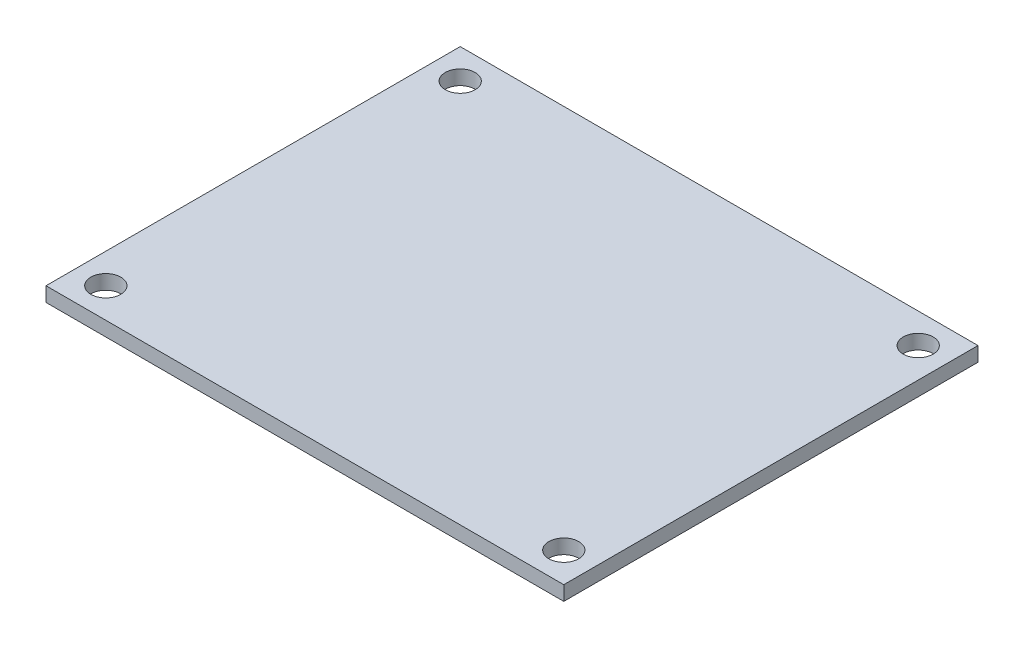
ISO-10303-21;
HEADER;
FILE_DESCRIPTION(('STEP AP214'),'2;1');
FILE_NAME('part.step','',(''),(''),'','','');
FILE_SCHEMA(('AUTOMOTIVE_DESIGN { 1 0 10303 214 1 1 1 1 }'));
ENDSEC;
DATA;
#1=APPLICATION_CONTEXT('core data for automotive mechanical design processes');
#2=APPLICATION_PROTOCOL_DEFINITION('international standard','automotive_design',2000,#1);
#3=PRODUCT_CONTEXT('',#1,'mechanical');
#4=PRODUCT('Part','Part','',(#3));
#5=PRODUCT_RELATED_PRODUCT_CATEGORY('part','',(#4));
#6=PRODUCT_DEFINITION_FORMATION('','',#4);
#7=PRODUCT_DEFINITION_CONTEXT('part definition',#1,'design');
#8=PRODUCT_DEFINITION('design','',#6,#7);
#9=PRODUCT_DEFINITION_SHAPE('','',#8);
#10=(LENGTH_UNIT() NAMED_UNIT(*) SI_UNIT(.MILLI.,.METRE.));
#11=(NAMED_UNIT(*) PLANE_ANGLE_UNIT() SI_UNIT($,.RADIAN.));
#12=(NAMED_UNIT(*) SI_UNIT($,.STERADIAN.) SOLID_ANGLE_UNIT());
#13=UNCERTAINTY_MEASURE_WITH_UNIT(LENGTH_MEASURE(1.E-05),#10,'distance_accuracy_value','');
#14=(GEOMETRIC_REPRESENTATION_CONTEXT(3) GLOBAL_UNCERTAINTY_ASSIGNED_CONTEXT((#13)) GLOBAL_UNIT_ASSIGNED_CONTEXT((#10,
#11,#12)) REPRESENTATION_CONTEXT('',''));
#15=CARTESIAN_POINT('',(0.,0.,0.));
#16=DIRECTION('',(0.,0.,1.));
#17=DIRECTION('',(1.,0.,0.));
#18=AXIS2_PLACEMENT_3D('',#15,#16,#17);
#19=CARTESIAN_POINT('',(1.26309066177774,1.600000102,-23.2970055394563));
#20=DIRECTION('',(0.,0.,-1.));
#21=DIRECTION('',(-1.,0.,0.));
#22=AXIS2_PLACEMENT_3D('',#19,#20,#21);
#23=PLANE('',#22);
#24=DIRECTION('',(1.,0.,0.));
#25=VECTOR('',#24,1.);
#26=CARTESIAN_POINT('',(1.26309066177774,0.,-23.2970055394563));
#27=LINE('',#26,#25);
#28=CARTESIAN_POINT('',(1.26309066177774,0.,-23.2970055394563));
#29=VERTEX_POINT('',#28);
#30=CARTESIAN_POINT('',(58.4130906617777,0.,-23.2970055394563));
#31=VERTEX_POINT('',#30);
#32=EDGE_CURVE('E99',#29,#31,#27,.T.);
#33=ORIENTED_EDGE('',*,*,#32,.F.);
#34=DIRECTION('',(0.,-1.,0.));
#35=VECTOR('',#34,1.);
#36=CARTESIAN_POINT('',(1.26309066177774,1.600000102,-23.2970055394563));
#37=LINE('',#36,#35);
#38=CARTESIAN_POINT('',(1.26309066177774,1.600000102,-23.2970055394563));
#39=VERTEX_POINT('',#38);
#40=EDGE_CURVE('E11',#39,#29,#37,.T.);
#41=ORIENTED_EDGE('',*,*,#40,.F.);
#42=DIRECTION('',(1.,0.,0.));
#43=VECTOR('',#42,1.);
#44=CARTESIAN_POINT('',(1.26309066177774,1.600000102,-23.2970055394563));
#45=LINE('',#44,#43);
#46=CARTESIAN_POINT('',(58.4130906617777,1.600000102,-23.2970055394563));
#47=VERTEX_POINT('',#46);
#48=EDGE_CURVE('E92',#39,#47,#45,.T.);
#49=ORIENTED_EDGE('',*,*,#48,.T.);
#50=DIRECTION('',(0.,-1.,0.));
#51=VECTOR('',#50,1.);
#52=CARTESIAN_POINT('',(58.4130906617777,1.600000102,-23.2970055394563));
#53=LINE('',#52,#51);
#54=EDGE_CURVE('E37',#47,#31,#53,.T.);
#55=ORIENTED_EDGE('',*,*,#54,.T.);
#56=EDGE_LOOP('',(#33,#41,#49,#55));
#57=FACE_BOUND('',#56,.T.);
#58=ADVANCED_FACE('F34',(#57),#23,.T.);
#59=CARTESIAN_POINT('',(1.26309066177774,1.600000102,22.4229944605437));
#60=DIRECTION('',(-1.,0.,0.));
#61=DIRECTION('',(0.,0.,1.));
#62=AXIS2_PLACEMENT_3D('',#59,#60,#61);
#63=PLANE('',#62);
#64=DIRECTION('',(0.,0.,-1.));
#65=VECTOR('',#64,1.);
#66=CARTESIAN_POINT('',(1.26309066177774,0.,22.4229944605437));
#67=LINE('',#66,#65);
#68=CARTESIAN_POINT('',(1.26309066177774,0.,22.4229944605437));
#69=VERTEX_POINT('',#68);
#70=EDGE_CURVE('E94',#69,#29,#67,.T.);
#71=ORIENTED_EDGE('',*,*,#70,.F.);
#72=DIRECTION('',(0.,-1.,0.));
#73=VECTOR('',#72,1.);
#74=CARTESIAN_POINT('',(1.26309066177774,1.600000102,22.4229944605437));
#75=LINE('',#74,#73);
#76=CARTESIAN_POINT('',(1.26309066177774,1.600000102,22.4229944605437));
#77=VERTEX_POINT('',#76);
#78=EDGE_CURVE('E43',#77,#69,#75,.T.);
#79=ORIENTED_EDGE('',*,*,#78,.F.);
#80=DIRECTION('',(0.,0.,-1.));
#81=VECTOR('',#80,1.);
#82=CARTESIAN_POINT('',(1.26309066177774,1.600000102,22.4229944605437));
#83=LINE('',#82,#81);
#84=EDGE_CURVE('E82',#77,#39,#83,.T.);
#85=ORIENTED_EDGE('',*,*,#84,.T.);
#86=ORIENTED_EDGE('',*,*,#40,.T.);
#87=EDGE_LOOP('',(#71,#79,#85,#86));
#88=FACE_BOUND('',#87,.T.);
#89=ADVANCED_FACE('F110',(#88),#63,.T.);
#90=CARTESIAN_POINT('',(1.26309066177774,1.600000102,22.4229944605437));
#91=DIRECTION('',(0.,0.,-1.));
#92=DIRECTION('',(-1.,0.,0.));
#93=AXIS2_PLACEMENT_3D('',#90,#91,#92);
#94=PLANE('',#93);
#95=DIRECTION('',(1.,0.,0.));
#96=VECTOR('',#95,1.);
#97=CARTESIAN_POINT('',(1.26309066177774,0.,22.4229944605437));
#98=LINE('',#97,#96);
#99=CARTESIAN_POINT('',(58.4130906617777,0.,22.4229944605437));
#100=VERTEX_POINT('',#99);
#101=EDGE_CURVE('E87',#69,#100,#98,.T.);
#102=ORIENTED_EDGE('',*,*,#101,.T.);
#103=DIRECTION('',(0.,-1.,0.));
#104=VECTOR('',#103,1.);
#105=CARTESIAN_POINT('',(58.4130906617777,1.600000102,22.4229944605437));
#106=LINE('',#105,#104);
#107=CARTESIAN_POINT('',(58.4130906617777,1.600000102,22.4229944605437));
#108=VERTEX_POINT('',#107);
#109=EDGE_CURVE('E85',#108,#100,#106,.T.);
#110=ORIENTED_EDGE('',*,*,#109,.F.);
#111=DIRECTION('',(1.,0.,0.));
#112=VECTOR('',#111,1.);
#113=CARTESIAN_POINT('',(1.26309066177774,1.600000102,22.4229944605437));
#114=LINE('',#113,#112);
#115=EDGE_CURVE('E79',#77,#108,#114,.T.);
#116=ORIENTED_EDGE('',*,*,#115,.F.);
#117=ORIENTED_EDGE('',*,*,#78,.T.);
#118=EDGE_LOOP('',(#102,#110,#116,#117));
#119=FACE_BOUND('',#118,.T.);
#120=ADVANCED_FACE('F86',(#119),#94,.F.);
#121=CARTESIAN_POINT('',(58.4130906617777,1.600000102,22.4229944605437));
#122=DIRECTION('',(-1.,0.,0.));
#123=DIRECTION('',(0.,0.,1.));
#124=AXIS2_PLACEMENT_3D('',#121,#122,#123);
#125=PLANE('',#124);
#126=DIRECTION('',(0.,0.,-1.));
#127=VECTOR('',#126,1.);
#128=CARTESIAN_POINT('',(58.4130906617777,0.,22.4229944605437));
#129=LINE('',#128,#127);
#130=EDGE_CURVE('E102',#100,#31,#129,.T.);
#131=ORIENTED_EDGE('',*,*,#130,.T.);
#132=ORIENTED_EDGE('',*,*,#54,.F.);
#133=DIRECTION('',(0.,0.,-1.));
#134=VECTOR('',#133,1.);
#135=CARTESIAN_POINT('',(58.4130906617777,1.600000102,22.4229944605437));
#136=LINE('',#135,#134);
#137=EDGE_CURVE('E76',#108,#47,#136,.T.);
#138=ORIENTED_EDGE('',*,*,#137,.F.);
#139=ORIENTED_EDGE('',*,*,#109,.T.);
#140=EDGE_LOOP('',(#131,#132,#138,#139));
#141=FACE_BOUND('',#140,.T.);
#142=ADVANCED_FACE('F91',(#141),#125,.F.);
#143=CARTESIAN_POINT('',(0.,1.600000102,0.));
#144=DIRECTION('',(0.,1.,0.));
#145=DIRECTION('',(0.,0.,1.));
#146=AXIS2_PLACEMENT_3D('',#143,#144,#145);
#147=PLANE('',#146);
#148=CARTESIAN_POINT('',(55.1130906617777,1.600000102,19.1229944605437));
#149=DIRECTION('',(0.,1.,0.));
#150=DIRECTION('',(0.,0.,-1.));
#151=AXIS2_PLACEMENT_3D('',#148,#149,#150);
#152=CIRCLE('',#151,1.65);
#153=CARTESIAN_POINT('',(55.1130906617777,1.600000102,20.7729944605437));
#154=VERTEX_POINT('',#153);
#155=EDGE_CURVE('E154',#154,#154,#152,.T.);
#156=ORIENTED_EDGE('',*,*,#155,.F.);
#157=EDGE_LOOP('',(#156));
#158=FACE_BOUND('',#157,.T.);
#159=CARTESIAN_POINT('',(55.1130906617777,1.600000102,-19.9970055394563));
#160=DIRECTION('',(0.,-1.,0.));
#161=DIRECTION('',(0.,0.,1.));
#162=AXIS2_PLACEMENT_3D('',#159,#160,#161);
#163=CIRCLE('',#162,1.65);
#164=CARTESIAN_POINT('',(55.1130906617777,1.600000102,-18.3470055394563));
#165=VERTEX_POINT('',#164);
#166=EDGE_CURVE('E156',#165,#165,#163,.T.);
#167=ORIENTED_EDGE('',*,*,#166,.T.);
#168=EDGE_LOOP('',(#167));
#169=FACE_BOUND('',#168,.T.);
#170=CARTESIAN_POINT('',(4.56309066177774,1.600000102,19.1229944605437));
#171=DIRECTION('',(0.,-1.,0.));
#172=DIRECTION('',(0.,0.,-1.));
#173=AXIS2_PLACEMENT_3D('',#170,#171,#172);
#174=CIRCLE('',#173,1.65);
#175=CARTESIAN_POINT('',(4.56309066177774,1.600000102,20.7729944605437));
#176=VERTEX_POINT('',#175);
#177=EDGE_CURVE('E162',#176,#176,#174,.T.);
#178=ORIENTED_EDGE('',*,*,#177,.T.);
#179=EDGE_LOOP('',(#178));
#180=FACE_BOUND('',#179,.T.);
#181=CARTESIAN_POINT('',(4.56309066177774,1.600000102,-19.9970055394563));
#182=DIRECTION('',(0.,1.,0.));
#183=DIRECTION('',(0.,0.,1.));
#184=AXIS2_PLACEMENT_3D('',#181,#182,#183);
#185=CIRCLE('',#184,1.65);
#186=CARTESIAN_POINT('',(4.56309066177774,1.600000102,-18.3470055394563));
#187=VERTEX_POINT('',#186);
#188=EDGE_CURVE('E168',#187,#187,#185,.T.);
#189=ORIENTED_EDGE('',*,*,#188,.F.);
#190=EDGE_LOOP('',(#189));
#191=FACE_BOUND('',#190,.T.);
#192=ORIENTED_EDGE('',*,*,#48,.F.);
#193=ORIENTED_EDGE('',*,*,#84,.F.);
#194=ORIENTED_EDGE('',*,*,#115,.T.);
#195=ORIENTED_EDGE('',*,*,#137,.T.);
#196=EDGE_LOOP('',(#192,#193,#194,#195));
#197=FACE_BOUND('',#196,.T.);
#198=ADVANCED_FACE('F81',(#158,#169,#180,#191,#197),#147,.T.);
#199=CARTESIAN_POINT('',(0.,0.,0.));
#200=DIRECTION('',(0.,1.,0.));
#201=DIRECTION('',(0.,0.,1.));
#202=AXIS2_PLACEMENT_3D('',#199,#200,#201);
#203=PLANE('',#202);
#204=CARTESIAN_POINT('',(55.1130906617777,0.,19.1229944605437));
#205=DIRECTION('',(0.,1.,0.));
#206=DIRECTION('',(0.,0.,-1.));
#207=AXIS2_PLACEMENT_3D('',#204,#205,#206);
#208=CIRCLE('',#207,1.65);
#209=CARTESIAN_POINT('',(55.1130906617777,0.,20.7729944605437));
#210=VERTEX_POINT('',#209);
#211=EDGE_CURVE('E152',#210,#210,#208,.T.);
#212=ORIENTED_EDGE('',*,*,#211,.T.);
#213=EDGE_LOOP('',(#212));
#214=FACE_BOUND('',#213,.T.);
#215=CARTESIAN_POINT('',(55.1130906617777,0.,-19.9970055394563));
#216=DIRECTION('',(0.,-1.,0.));
#217=DIRECTION('',(0.,0.,1.));
#218=AXIS2_PLACEMENT_3D('',#215,#216,#217);
#219=CIRCLE('',#218,1.65);
#220=CARTESIAN_POINT('',(55.1130906617777,0.,-18.3470055394563));
#221=VERTEX_POINT('',#220);
#222=EDGE_CURVE('E159',#221,#221,#219,.T.);
#223=ORIENTED_EDGE('',*,*,#222,.F.);
#224=EDGE_LOOP('',(#223));
#225=FACE_BOUND('',#224,.T.);
#226=CARTESIAN_POINT('',(4.56309066177774,0.,19.1229944605437));
#227=DIRECTION('',(0.,-1.,0.));
#228=DIRECTION('',(0.,0.,-1.));
#229=AXIS2_PLACEMENT_3D('',#226,#227,#228);
#230=CIRCLE('',#229,1.65);
#231=CARTESIAN_POINT('',(4.56309066177774,0.,20.7729944605437));
#232=VERTEX_POINT('',#231);
#233=EDGE_CURVE('E165',#232,#232,#230,.T.);
#234=ORIENTED_EDGE('',*,*,#233,.F.);
#235=EDGE_LOOP('',(#234));
#236=FACE_BOUND('',#235,.T.);
#237=CARTESIAN_POINT('',(4.56309066177774,0.,-19.9970055394563));
#238=DIRECTION('',(0.,1.,0.));
#239=DIRECTION('',(0.,0.,1.));
#240=AXIS2_PLACEMENT_3D('',#237,#238,#239);
#241=CIRCLE('',#240,1.65);
#242=CARTESIAN_POINT('',(4.56309066177774,0.,-18.3470055394563));
#243=VERTEX_POINT('',#242);
#244=EDGE_CURVE('E103',#243,#243,#241,.T.);
#245=ORIENTED_EDGE('',*,*,#244,.T.);
#246=EDGE_LOOP('',(#245));
#247=FACE_BOUND('',#246,.T.);
#248=ORIENTED_EDGE('',*,*,#32,.T.);
#249=ORIENTED_EDGE('',*,*,#130,.F.);
#250=ORIENTED_EDGE('',*,*,#101,.F.);
#251=ORIENTED_EDGE('',*,*,#70,.T.);
#252=EDGE_LOOP('',(#248,#249,#250,#251));
#253=FACE_BOUND('',#252,.T.);
#254=ADVANCED_FACE('F109',(#214,#225,#236,#247,#253),#203,.F.);
#255=CARTESIAN_POINT('',(4.56309066177774,0.,-19.9970055394563));
#256=DIRECTION('',(0.,1.,0.));
#257=DIRECTION('',(0.,0.,1.));
#258=AXIS2_PLACEMENT_3D('',#255,#256,#257);
#259=CYLINDRICAL_SURFACE('',#258,1.65);
#260=CARTESIAN_POINT('',(4.56309066177774,0.,-18.3470055394563));
#261=CARTESIAN_POINT('',(4.56309066177774,0.0166666677291667,-18.3470055394563));
#262=CARTESIAN_POINT('',(4.56309066177774,0.0333333354583333,-18.3470055394563));
#263=CARTESIAN_POINT('',(4.56309066177774,0.0666666709166667,-18.3470055394563));
#264=CARTESIAN_POINT('',(4.56309066177774,0.0833333386458333,-18.3470055394563));
#265=CARTESIAN_POINT('',(4.56309066177774,0.116666674104167,-18.3470055394563));
#266=CARTESIAN_POINT('',(4.56309066177774,0.133333341833333,-18.3470055394563));
#267=CARTESIAN_POINT('',(4.56309066177774,0.166666677291667,-18.3470055394563));
#268=CARTESIAN_POINT('',(4.56309066177774,0.183333345020833,-18.3470055394563));
#269=CARTESIAN_POINT('',(4.56309066177774,0.216666680479167,-18.3470055394563));
#270=CARTESIAN_POINT('',(4.56309066177774,0.233333348208333,-18.3470055394563));
#271=CARTESIAN_POINT('',(4.56309066177774,0.266666683666667,-18.3470055394563));
#272=CARTESIAN_POINT('',(4.56309066177774,0.283333351395833,-18.3470055394563));
#273=CARTESIAN_POINT('',(4.56309066177774,0.316666686854167,-18.3470055394563));
#274=CARTESIAN_POINT('',(4.56309066177774,0.333333354583333,-18.3470055394563));
#275=CARTESIAN_POINT('',(4.56309066177774,0.366666690041667,-18.3470055394563));
#276=CARTESIAN_POINT('',(4.56309066177774,0.383333357770833,-18.3470055394563));
#277=CARTESIAN_POINT('',(4.56309066177774,0.416666693229167,-18.3470055394563));
#278=CARTESIAN_POINT('',(4.56309066177774,0.433333360958333,-18.3470055394563));
#279=CARTESIAN_POINT('',(4.56309066177774,0.466666696416667,-18.3470055394563));
#280=CARTESIAN_POINT('',(4.56309066177774,0.483333364145833,-18.3470055394563));
#281=CARTESIAN_POINT('',(4.56309066177774,0.516666699604167,-18.3470055394563));
#282=CARTESIAN_POINT('',(4.56309066177774,0.533333367333333,-18.3470055394563));
#283=CARTESIAN_POINT('',(4.56309066177774,0.566666702791667,-18.3470055394563));
#284=CARTESIAN_POINT('',(4.56309066177774,0.583333370520833,-18.3470055394563));
#285=CARTESIAN_POINT('',(4.56309066177774,0.616666705979167,-18.3470055394563));
#286=CARTESIAN_POINT('',(4.56309066177774,0.633333373708333,-18.3470055394563));
#287=CARTESIAN_POINT('',(4.56309066177774,0.666666709166667,-18.3470055394563));
#288=CARTESIAN_POINT('',(4.56309066177774,0.683333376895833,-18.3470055394563));
#289=CARTESIAN_POINT('',(4.56309066177774,0.716666712354167,-18.3470055394563));
#290=CARTESIAN_POINT('',(4.56309066177774,0.733333380083333,-18.3470055394563));
#291=CARTESIAN_POINT('',(4.56309066177774,0.766666715541667,-18.3470055394563));
#292=CARTESIAN_POINT('',(4.56309066177774,0.783333383270833,-18.3470055394563));
#293=CARTESIAN_POINT('',(4.56309066177774,0.816666718729167,-18.3470055394563));
#294=CARTESIAN_POINT('',(4.56309066177774,0.833333386458333,-18.3470055394563));
#295=CARTESIAN_POINT('',(4.56309066177774,0.866666721916666,-18.3470055394563));
#296=CARTESIAN_POINT('',(4.56309066177774,0.883333389645833,-18.3470055394563));
#297=CARTESIAN_POINT('',(4.56309066177774,0.916666725104166,-18.3470055394563));
#298=CARTESIAN_POINT('',(4.56309066177774,0.933333392833333,-18.3470055394563));
#299=CARTESIAN_POINT('',(4.56309066177774,0.966666728291666,-18.3470055394563));
#300=CARTESIAN_POINT('',(4.56309066177774,0.983333396020833,-18.3470055394563));
#301=CARTESIAN_POINT('',(4.56309066177774,1.01666673147917,-18.3470055394563));
#302=CARTESIAN_POINT('',(4.56309066177774,1.03333339920833,-18.3470055394563));
#303=CARTESIAN_POINT('',(4.56309066177774,1.06666673466667,-18.3470055394563));
#304=CARTESIAN_POINT('',(4.56309066177774,1.08333340239583,-18.3470055394563));
#305=CARTESIAN_POINT('',(4.56309066177774,1.11666673785417,-18.3470055394563));
#306=CARTESIAN_POINT('',(4.56309066177774,1.13333340558333,-18.3470055394563));
#307=CARTESIAN_POINT('',(4.56309066177774,1.16666674104167,-18.3470055394563));
#308=CARTESIAN_POINT('',(4.56309066177774,1.18333340877083,-18.3470055394563));
#309=CARTESIAN_POINT('',(4.56309066177774,1.21666674422917,-18.3470055394563));
#310=CARTESIAN_POINT('',(4.56309066177774,1.23333341195833,-18.3470055394563));
#311=CARTESIAN_POINT('',(4.56309066177774,1.26666674741667,-18.3470055394563));
#312=CARTESIAN_POINT('',(4.56309066177774,1.28333341514583,-18.3470055394563));
#313=CARTESIAN_POINT('',(4.56309066177774,1.31666675060417,-18.3470055394563));
#314=CARTESIAN_POINT('',(4.56309066177774,1.33333341833333,-18.3470055394563));
#315=CARTESIAN_POINT('',(4.56309066177774,1.36666675379167,-18.3470055394563));
#316=CARTESIAN_POINT('',(4.56309066177774,1.38333342152083,-18.3470055394563));
#317=CARTESIAN_POINT('',(4.56309066177774,1.41666675697917,-18.3470055394563));
#318=CARTESIAN_POINT('',(4.56309066177774,1.43333342470833,-18.3470055394563));
#319=CARTESIAN_POINT('',(4.56309066177774,1.46666676016667,-18.3470055394563));
#320=CARTESIAN_POINT('',(4.56309066177774,1.48333342789583,-18.3470055394563));
#321=CARTESIAN_POINT('',(4.56309066177774,1.51666676335417,-18.3470055394563));
#322=CARTESIAN_POINT('',(4.56309066177774,1.53333343108333,-18.3470055394563));
#323=CARTESIAN_POINT('',(4.56309066177774,1.56666676654167,-18.3470055394563));
#324=CARTESIAN_POINT('',(4.56309066177774,1.58333343427083,-18.3470055394563));
#325=CARTESIAN_POINT('',(4.56309066177774,1.600000102,-18.3470055394563));
#326=B_SPLINE_CURVE_WITH_KNOTS('',3,(#260,#261,#262,#263,#264,#265,#266,#267,#268,#269,#270,
#271,#272,#273,#274,#275,#276,#277,#278,#279,#280,#281,#282,#283,#284,#285,#286,#287,#288,#289,
#290,#291,#292,#293,#294,#295,#296,#297,#298,#299,#300,#301,#302,#303,#304,#305,#306,#307,#308,
#309,#310,#311,#312,#313,#314,#315,#316,#317,#318,#319,#320,#321,#322,#323,#324,#325),
.UNSPECIFIED.,.F.,.F.,(4,2,2,2,2,2,2,2,2,2,2,2,2,2,2,2,2,2,2,2,2,2,2,2,2,2,2,2,2,2,2,2,4),(0.,
0.0500000031875,0.100000006375,0.1500000095625,0.20000001275,0.2500000159375,0.300000019125,
0.3500000223125,0.4000000255,0.4500000286875,0.500000031875,0.5500000350625,0.60000003825,
0.6500000414375,0.700000044625,0.7500000478125,0.800000051,0.8500000541875,0.900000057375,
0.9500000605625,1.00000006375,1.0500000669375,1.100000070125,1.1500000733125,1.2000000765,
1.2500000796875,1.300000082875,1.3500000860625,1.40000008925,1.4500000924375,1.500000095625,
1.5500000988125,1.600000102),.UNSPECIFIED.);
#327=EDGE_CURVE('BSEAM128',#243,#187,#326,.T.);
#328=ORIENTED_EDGE('',*,*,#244,.F.);
#329=ORIENTED_EDGE('',*,*,#188,.T.);
#330=ORIENTED_EDGE('',*,*,#327,.T.);
#331=ORIENTED_EDGE('',*,*,#327,.F.);
#332=EDGE_LOOP('',(#328,#330,#329,#331));
#333=FACE_BOUND('',#332,.T.);
#334=ADVANCED_FACE('F128',(#333),#259,.F.);
#335=CARTESIAN_POINT('',(4.56309066177774,0.,19.1229944605437));
#336=DIRECTION('',(0.,1.,0.));
#337=DIRECTION('',(0.,0.,1.));
#338=AXIS2_PLACEMENT_3D('',#335,#336,#337);
#339=CYLINDRICAL_SURFACE('',#338,1.65);
#340=CARTESIAN_POINT('',(4.56309066177774,0.,20.7729944605437));
#341=CARTESIAN_POINT('',(4.56309066177774,0.0166666677291667,20.7729944605437));
#342=CARTESIAN_POINT('',(4.56309066177774,0.0333333354583333,20.7729944605437));
#343=CARTESIAN_POINT('',(4.56309066177774,0.0666666709166667,20.7729944605437));
#344=CARTESIAN_POINT('',(4.56309066177774,0.0833333386458333,20.7729944605437));
#345=CARTESIAN_POINT('',(4.56309066177774,0.116666674104167,20.7729944605437));
#346=CARTESIAN_POINT('',(4.56309066177774,0.133333341833333,20.7729944605437));
#347=CARTESIAN_POINT('',(4.56309066177774,0.166666677291667,20.7729944605437));
#348=CARTESIAN_POINT('',(4.56309066177774,0.183333345020833,20.7729944605437));
#349=CARTESIAN_POINT('',(4.56309066177774,0.216666680479167,20.7729944605437));
#350=CARTESIAN_POINT('',(4.56309066177774,0.233333348208333,20.7729944605437));
#351=CARTESIAN_POINT('',(4.56309066177774,0.266666683666667,20.7729944605437));
#352=CARTESIAN_POINT('',(4.56309066177774,0.283333351395833,20.7729944605437));
#353=CARTESIAN_POINT('',(4.56309066177774,0.316666686854167,20.7729944605437));
#354=CARTESIAN_POINT('',(4.56309066177774,0.333333354583333,20.7729944605437));
#355=CARTESIAN_POINT('',(4.56309066177774,0.366666690041667,20.7729944605437));
#356=CARTESIAN_POINT('',(4.56309066177774,0.383333357770833,20.7729944605437));
#357=CARTESIAN_POINT('',(4.56309066177774,0.416666693229167,20.7729944605437));
#358=CARTESIAN_POINT('',(4.56309066177774,0.433333360958333,20.7729944605437));
#359=CARTESIAN_POINT('',(4.56309066177774,0.466666696416667,20.7729944605437));
#360=CARTESIAN_POINT('',(4.56309066177774,0.483333364145833,20.7729944605437));
#361=CARTESIAN_POINT('',(4.56309066177774,0.516666699604167,20.7729944605437));
#362=CARTESIAN_POINT('',(4.56309066177774,0.533333367333333,20.7729944605437));
#363=CARTESIAN_POINT('',(4.56309066177774,0.566666702791667,20.7729944605437));
#364=CARTESIAN_POINT('',(4.56309066177774,0.583333370520833,20.7729944605437));
#365=CARTESIAN_POINT('',(4.56309066177774,0.616666705979167,20.7729944605437));
#366=CARTESIAN_POINT('',(4.56309066177774,0.633333373708333,20.7729944605437));
#367=CARTESIAN_POINT('',(4.56309066177774,0.666666709166667,20.7729944605437));
#368=CARTESIAN_POINT('',(4.56309066177774,0.683333376895833,20.7729944605437));
#369=CARTESIAN_POINT('',(4.56309066177774,0.716666712354167,20.7729944605437));
#370=CARTESIAN_POINT('',(4.56309066177774,0.733333380083333,20.7729944605437));
#371=CARTESIAN_POINT('',(4.56309066177774,0.766666715541667,20.7729944605437));
#372=CARTESIAN_POINT('',(4.56309066177774,0.783333383270833,20.7729944605437));
#373=CARTESIAN_POINT('',(4.56309066177774,0.816666718729167,20.7729944605437));
#374=CARTESIAN_POINT('',(4.56309066177774,0.833333386458333,20.7729944605437));
#375=CARTESIAN_POINT('',(4.56309066177774,0.866666721916667,20.7729944605437));
#376=CARTESIAN_POINT('',(4.56309066177774,0.883333389645833,20.7729944605437));
#377=CARTESIAN_POINT('',(4.56309066177774,0.916666725104167,20.7729944605437));
#378=CARTESIAN_POINT('',(4.56309066177774,0.933333392833333,20.7729944605437));
#379=CARTESIAN_POINT('',(4.56309066177774,0.966666728291667,20.7729944605437));
#380=CARTESIAN_POINT('',(4.56309066177774,0.983333396020833,20.7729944605437));
#381=CARTESIAN_POINT('',(4.56309066177774,1.01666673147917,20.7729944605437));
#382=CARTESIAN_POINT('',(4.56309066177774,1.03333339920833,20.7729944605437));
#383=CARTESIAN_POINT('',(4.56309066177774,1.06666673466667,20.7729944605437));
#384=CARTESIAN_POINT('',(4.56309066177774,1.08333340239583,20.7729944605437));
#385=CARTESIAN_POINT('',(4.56309066177774,1.11666673785417,20.7729944605437));
#386=CARTESIAN_POINT('',(4.56309066177774,1.13333340558333,20.7729944605437));
#387=CARTESIAN_POINT('',(4.56309066177774,1.16666674104167,20.7729944605437));
#388=CARTESIAN_POINT('',(4.56309066177774,1.18333340877083,20.7729944605437));
#389=CARTESIAN_POINT('',(4.56309066177774,1.21666674422917,20.7729944605437));
#390=CARTESIAN_POINT('',(4.56309066177774,1.23333341195833,20.7729944605437));
#391=CARTESIAN_POINT('',(4.56309066177774,1.26666674741667,20.7729944605437));
#392=CARTESIAN_POINT('',(4.56309066177774,1.28333341514583,20.7729944605437));
#393=CARTESIAN_POINT('',(4.56309066177774,1.31666675060417,20.7729944605437));
#394=CARTESIAN_POINT('',(4.56309066177774,1.33333341833333,20.7729944605437));
#395=CARTESIAN_POINT('',(4.56309066177774,1.36666675379167,20.7729944605437));
#396=CARTESIAN_POINT('',(4.56309066177774,1.38333342152083,20.7729944605437));
#397=CARTESIAN_POINT('',(4.56309066177774,1.41666675697917,20.7729944605437));
#398=CARTESIAN_POINT('',(4.56309066177774,1.43333342470833,20.7729944605437));
#399=CARTESIAN_POINT('',(4.56309066177774,1.46666676016667,20.7729944605437));
#400=CARTESIAN_POINT('',(4.56309066177774,1.48333342789583,20.7729944605437));
#401=CARTESIAN_POINT('',(4.56309066177774,1.51666676335417,20.7729944605437));
#402=CARTESIAN_POINT('',(4.56309066177774,1.53333343108333,20.7729944605437));
#403=CARTESIAN_POINT('',(4.56309066177774,1.56666676654167,20.7729944605437));
#404=CARTESIAN_POINT('',(4.56309066177774,1.58333343427083,20.7729944605437));
#405=CARTESIAN_POINT('',(4.56309066177774,1.600000102,20.7729944605437));
#406=B_SPLINE_CURVE_WITH_KNOTS('',3,(#340,#341,#342,#343,#344,#345,#346,#347,#348,#349,#350,
#351,#352,#353,#354,#355,#356,#357,#358,#359,#360,#361,#362,#363,#364,#365,#366,#367,#368,#369,
#370,#371,#372,#373,#374,#375,#376,#377,#378,#379,#380,#381,#382,#383,#384,#385,#386,#387,#388,
#389,#390,#391,#392,#393,#394,#395,#396,#397,#398,#399,#400,#401,#402,#403,#404,#405),
.UNSPECIFIED.,.F.,.F.,(4,2,2,2,2,2,2,2,2,2,2,2,2,2,2,2,2,2,2,2,2,2,2,2,2,2,2,2,2,2,2,2,4),(0.,
0.0500000031875,0.100000006375,0.1500000095625,0.20000001275,0.2500000159375,0.300000019125,
0.3500000223125,0.4000000255,0.4500000286875,0.500000031875,0.5500000350625,0.60000003825,
0.6500000414375,0.700000044625,0.7500000478125,0.800000051,0.8500000541875,0.900000057375,
0.9500000605625,1.00000006375,1.0500000669375,1.100000070125,1.1500000733125,1.2000000765,
1.2500000796875,1.300000082875,1.3500000860625,1.40000008925,1.4500000924375,1.500000095625,
1.5500000988125,1.600000102),.UNSPECIFIED.);
#407=EDGE_CURVE('BSEAM135',#232,#176,#406,.T.);
#408=ORIENTED_EDGE('',*,*,#233,.T.);
#409=ORIENTED_EDGE('',*,*,#177,.F.);
#410=ORIENTED_EDGE('',*,*,#407,.T.);
#411=ORIENTED_EDGE('',*,*,#407,.F.);
#412=EDGE_LOOP('',(#408,#410,#409,#411));
#413=FACE_BOUND('',#412,.T.);
#414=ADVANCED_FACE('F135',(#413),#339,.F.);
#415=CARTESIAN_POINT('',(55.1130906617777,0.,-19.9970055394563));
#416=DIRECTION('',(0.,1.,0.));
#417=DIRECTION('',(0.,0.,1.));
#418=AXIS2_PLACEMENT_3D('',#415,#416,#417);
#419=CYLINDRICAL_SURFACE('',#418,1.65);
#420=CARTESIAN_POINT('',(55.1130906617777,0.,-18.3470055394563));
#421=CARTESIAN_POINT('',(55.1130906617777,0.0166666677291667,-18.3470055394563));
#422=CARTESIAN_POINT('',(55.1130906617777,0.0333333354583333,-18.3470055394563));
#423=CARTESIAN_POINT('',(55.1130906617777,0.0666666709166667,-18.3470055394563));
#424=CARTESIAN_POINT('',(55.1130906617777,0.0833333386458333,-18.3470055394563));
#425=CARTESIAN_POINT('',(55.1130906617777,0.116666674104167,-18.3470055394563));
#426=CARTESIAN_POINT('',(55.1130906617777,0.133333341833333,-18.3470055394563));
#427=CARTESIAN_POINT('',(55.1130906617777,0.166666677291667,-18.3470055394563));
#428=CARTESIAN_POINT('',(55.1130906617777,0.183333345020833,-18.3470055394563));
#429=CARTESIAN_POINT('',(55.1130906617777,0.216666680479167,-18.3470055394563));
#430=CARTESIAN_POINT('',(55.1130906617777,0.233333348208333,-18.3470055394563));
#431=CARTESIAN_POINT('',(55.1130906617777,0.266666683666667,-18.3470055394563));
#432=CARTESIAN_POINT('',(55.1130906617777,0.283333351395833,-18.3470055394563));
#433=CARTESIAN_POINT('',(55.1130906617777,0.316666686854167,-18.3470055394563));
#434=CARTESIAN_POINT('',(55.1130906617777,0.333333354583333,-18.3470055394563));
#435=CARTESIAN_POINT('',(55.1130906617777,0.366666690041667,-18.3470055394563));
#436=CARTESIAN_POINT('',(55.1130906617777,0.383333357770833,-18.3470055394563));
#437=CARTESIAN_POINT('',(55.1130906617777,0.416666693229167,-18.3470055394563));
#438=CARTESIAN_POINT('',(55.1130906617777,0.433333360958333,-18.3470055394563));
#439=CARTESIAN_POINT('',(55.1130906617777,0.466666696416667,-18.3470055394563));
#440=CARTESIAN_POINT('',(55.1130906617777,0.483333364145833,-18.3470055394563));
#441=CARTESIAN_POINT('',(55.1130906617777,0.516666699604167,-18.3470055394563));
#442=CARTESIAN_POINT('',(55.1130906617777,0.533333367333333,-18.3470055394563));
#443=CARTESIAN_POINT('',(55.1130906617777,0.566666702791667,-18.3470055394563));
#444=CARTESIAN_POINT('',(55.1130906617777,0.583333370520833,-18.3470055394563));
#445=CARTESIAN_POINT('',(55.1130906617777,0.616666705979167,-18.3470055394563));
#446=CARTESIAN_POINT('',(55.1130906617777,0.633333373708333,-18.3470055394563));
#447=CARTESIAN_POINT('',(55.1130906617777,0.666666709166667,-18.3470055394563));
#448=CARTESIAN_POINT('',(55.1130906617777,0.683333376895833,-18.3470055394563));
#449=CARTESIAN_POINT('',(55.1130906617777,0.716666712354167,-18.3470055394563));
#450=CARTESIAN_POINT('',(55.1130906617777,0.733333380083333,-18.3470055394563));
#451=CARTESIAN_POINT('',(55.1130906617777,0.766666715541667,-18.3470055394563));
#452=CARTESIAN_POINT('',(55.1130906617777,0.783333383270833,-18.3470055394563));
#453=CARTESIAN_POINT('',(55.1130906617777,0.816666718729167,-18.3470055394563));
#454=CARTESIAN_POINT('',(55.1130906617777,0.833333386458333,-18.3470055394563));
#455=CARTESIAN_POINT('',(55.1130906617777,0.866666721916667,-18.3470055394563));
#456=CARTESIAN_POINT('',(55.1130906617777,0.883333389645833,-18.3470055394563));
#457=CARTESIAN_POINT('',(55.1130906617777,0.916666725104167,-18.3470055394563));
#458=CARTESIAN_POINT('',(55.1130906617777,0.933333392833333,-18.3470055394563));
#459=CARTESIAN_POINT('',(55.1130906617777,0.966666728291667,-18.3470055394563));
#460=CARTESIAN_POINT('',(55.1130906617777,0.983333396020833,-18.3470055394563));
#461=CARTESIAN_POINT('',(55.1130906617777,1.01666673147917,-18.3470055394563));
#462=CARTESIAN_POINT('',(55.1130906617777,1.03333339920833,-18.3470055394563));
#463=CARTESIAN_POINT('',(55.1130906617777,1.06666673466667,-18.3470055394563));
#464=CARTESIAN_POINT('',(55.1130906617777,1.08333340239583,-18.3470055394563));
#465=CARTESIAN_POINT('',(55.1130906617777,1.11666673785417,-18.3470055394563));
#466=CARTESIAN_POINT('',(55.1130906617777,1.13333340558333,-18.3470055394563));
#467=CARTESIAN_POINT('',(55.1130906617777,1.16666674104167,-18.3470055394563));
#468=CARTESIAN_POINT('',(55.1130906617777,1.18333340877083,-18.3470055394563));
#469=CARTESIAN_POINT('',(55.1130906617777,1.21666674422917,-18.3470055394563));
#470=CARTESIAN_POINT('',(55.1130906617777,1.23333341195833,-18.3470055394563));
#471=CARTESIAN_POINT('',(55.1130906617777,1.26666674741667,-18.3470055394563));
#472=CARTESIAN_POINT('',(55.1130906617777,1.28333341514583,-18.3470055394563));
#473=CARTESIAN_POINT('',(55.1130906617777,1.31666675060417,-18.3470055394563));
#474=CARTESIAN_POINT('',(55.1130906617777,1.33333341833333,-18.3470055394563));
#475=CARTESIAN_POINT('',(55.1130906617777,1.36666675379167,-18.3470055394563));
#476=CARTESIAN_POINT('',(55.1130906617777,1.38333342152083,-18.3470055394563));
#477=CARTESIAN_POINT('',(55.1130906617777,1.41666675697917,-18.3470055394563));
#478=CARTESIAN_POINT('',(55.1130906617777,1.43333342470833,-18.3470055394563));
#479=CARTESIAN_POINT('',(55.1130906617777,1.46666676016667,-18.3470055394563));
#480=CARTESIAN_POINT('',(55.1130906617777,1.48333342789583,-18.3470055394563));
#481=CARTESIAN_POINT('',(55.1130906617777,1.51666676335417,-18.3470055394563));
#482=CARTESIAN_POINT('',(55.1130906617777,1.53333343108333,-18.3470055394563));
#483=CARTESIAN_POINT('',(55.1130906617777,1.56666676654167,-18.3470055394563));
#484=CARTESIAN_POINT('',(55.1130906617777,1.58333343427083,-18.3470055394563));
#485=CARTESIAN_POINT('',(55.1130906617777,1.600000102,-18.3470055394563));
#486=B_SPLINE_CURVE_WITH_KNOTS('',3,(#420,#421,#422,#423,#424,#425,#426,#427,#428,#429,#430,
#431,#432,#433,#434,#435,#436,#437,#438,#439,#440,#441,#442,#443,#444,#445,#446,#447,#448,#449,
#450,#451,#452,#453,#454,#455,#456,#457,#458,#459,#460,#461,#462,#463,#464,#465,#466,#467,#468,
#469,#470,#471,#472,#473,#474,#475,#476,#477,#478,#479,#480,#481,#482,#483,#484,#485),
.UNSPECIFIED.,.F.,.F.,(4,2,2,2,2,2,2,2,2,2,2,2,2,2,2,2,2,2,2,2,2,2,2,2,2,2,2,2,2,2,2,2,4),(0.,
0.0500000031875,0.100000006375,0.1500000095625,0.20000001275,0.2500000159375,0.300000019125,
0.3500000223125,0.4000000255,0.4500000286875,0.500000031875,0.5500000350625,0.60000003825,
0.6500000414375,0.700000044625,0.7500000478125,0.800000051,0.8500000541875,0.900000057375,
0.9500000605625,1.00000006375,1.0500000669375,1.100000070125,1.1500000733125,1.2000000765,
1.2500000796875,1.300000082875,1.3500000860625,1.40000008925,1.4500000924375,1.500000095625,
1.5500000988125,1.600000102),.UNSPECIFIED.);
#487=EDGE_CURVE('BSEAM139',#221,#165,#486,.T.);
#488=ORIENTED_EDGE('',*,*,#222,.T.);
#489=ORIENTED_EDGE('',*,*,#166,.F.);
#490=ORIENTED_EDGE('',*,*,#487,.T.);
#491=ORIENTED_EDGE('',*,*,#487,.F.);
#492=EDGE_LOOP('',(#488,#490,#489,#491));
#493=FACE_BOUND('',#492,.T.);
#494=ADVANCED_FACE('F139',(#493),#419,.F.);
#495=CARTESIAN_POINT('',(55.1130906617777,0.,19.1229944605437));
#496=DIRECTION('',(0.,1.,0.));
#497=DIRECTION('',(0.,0.,1.));
#498=AXIS2_PLACEMENT_3D('',#495,#496,#497);
#499=CYLINDRICAL_SURFACE('',#498,1.65);
#500=CARTESIAN_POINT('',(55.1130906617777,0.,20.7729944605437));
#501=CARTESIAN_POINT('',(55.1130906617777,0.0166666677291667,20.7729944605437));
#502=CARTESIAN_POINT('',(55.1130906617777,0.0333333354583333,20.7729944605437));
#503=CARTESIAN_POINT('',(55.1130906617777,0.0666666709166667,20.7729944605437));
#504=CARTESIAN_POINT('',(55.1130906617777,0.0833333386458333,20.7729944605437));
#505=CARTESIAN_POINT('',(55.1130906617777,0.116666674104167,20.7729944605437));
#506=CARTESIAN_POINT('',(55.1130906617777,0.133333341833333,20.7729944605437));
#507=CARTESIAN_POINT('',(55.1130906617777,0.166666677291667,20.7729944605437));
#508=CARTESIAN_POINT('',(55.1130906617777,0.183333345020833,20.7729944605437));
#509=CARTESIAN_POINT('',(55.1130906617777,0.216666680479167,20.7729944605437));
#510=CARTESIAN_POINT('',(55.1130906617777,0.233333348208333,20.7729944605437));
#511=CARTESIAN_POINT('',(55.1130906617777,0.266666683666667,20.7729944605437));
#512=CARTESIAN_POINT('',(55.1130906617777,0.283333351395833,20.7729944605437));
#513=CARTESIAN_POINT('',(55.1130906617777,0.316666686854167,20.7729944605437));
#514=CARTESIAN_POINT('',(55.1130906617777,0.333333354583333,20.7729944605437));
#515=CARTESIAN_POINT('',(55.1130906617777,0.366666690041667,20.7729944605437));
#516=CARTESIAN_POINT('',(55.1130906617777,0.383333357770833,20.7729944605437));
#517=CARTESIAN_POINT('',(55.1130906617777,0.416666693229167,20.7729944605437));
#518=CARTESIAN_POINT('',(55.1130906617777,0.433333360958333,20.7729944605437));
#519=CARTESIAN_POINT('',(55.1130906617777,0.466666696416667,20.7729944605437));
#520=CARTESIAN_POINT('',(55.1130906617777,0.483333364145833,20.7729944605437));
#521=CARTESIAN_POINT('',(55.1130906617777,0.516666699604167,20.7729944605437));
#522=CARTESIAN_POINT('',(55.1130906617777,0.533333367333333,20.7729944605437));
#523=CARTESIAN_POINT('',(55.1130906617777,0.566666702791667,20.7729944605437));
#524=CARTESIAN_POINT('',(55.1130906617777,0.583333370520833,20.7729944605437));
#525=CARTESIAN_POINT('',(55.1130906617777,0.616666705979167,20.7729944605437));
#526=CARTESIAN_POINT('',(55.1130906617777,0.633333373708333,20.7729944605437));
#527=CARTESIAN_POINT('',(55.1130906617777,0.666666709166667,20.7729944605437));
#528=CARTESIAN_POINT('',(55.1130906617777,0.683333376895833,20.7729944605437));
#529=CARTESIAN_POINT('',(55.1130906617777,0.716666712354167,20.7729944605437));
#530=CARTESIAN_POINT('',(55.1130906617777,0.733333380083333,20.7729944605437));
#531=CARTESIAN_POINT('',(55.1130906617777,0.766666715541667,20.7729944605437));
#532=CARTESIAN_POINT('',(55.1130906617777,0.783333383270833,20.7729944605437));
#533=CARTESIAN_POINT('',(55.1130906617777,0.816666718729167,20.7729944605437));
#534=CARTESIAN_POINT('',(55.1130906617777,0.833333386458333,20.7729944605437));
#535=CARTESIAN_POINT('',(55.1130906617777,0.866666721916666,20.7729944605437));
#536=CARTESIAN_POINT('',(55.1130906617777,0.883333389645833,20.7729944605437));
#537=CARTESIAN_POINT('',(55.1130906617777,0.916666725104166,20.7729944605437));
#538=CARTESIAN_POINT('',(55.1130906617777,0.933333392833333,20.7729944605437));
#539=CARTESIAN_POINT('',(55.1130906617777,0.966666728291666,20.7729944605437));
#540=CARTESIAN_POINT('',(55.1130906617777,0.983333396020833,20.7729944605437));
#541=CARTESIAN_POINT('',(55.1130906617777,1.01666673147917,20.7729944605437));
#542=CARTESIAN_POINT('',(55.1130906617777,1.03333339920833,20.7729944605437));
#543=CARTESIAN_POINT('',(55.1130906617777,1.06666673466667,20.7729944605437));
#544=CARTESIAN_POINT('',(55.1130906617777,1.08333340239583,20.7729944605437));
#545=CARTESIAN_POINT('',(55.1130906617777,1.11666673785417,20.7729944605437));
#546=CARTESIAN_POINT('',(55.1130906617777,1.13333340558333,20.7729944605437));
#547=CARTESIAN_POINT('',(55.1130906617777,1.16666674104167,20.7729944605437));
#548=CARTESIAN_POINT('',(55.1130906617777,1.18333340877083,20.7729944605437));
#549=CARTESIAN_POINT('',(55.1130906617777,1.21666674422917,20.7729944605437));
#550=CARTESIAN_POINT('',(55.1130906617777,1.23333341195833,20.7729944605437));
#551=CARTESIAN_POINT('',(55.1130906617777,1.26666674741667,20.7729944605437));
#552=CARTESIAN_POINT('',(55.1130906617777,1.28333341514583,20.7729944605437));
#553=CARTESIAN_POINT('',(55.1130906617777,1.31666675060417,20.7729944605437));
#554=CARTESIAN_POINT('',(55.1130906617777,1.33333341833333,20.7729944605437));
#555=CARTESIAN_POINT('',(55.1130906617777,1.36666675379167,20.7729944605437));
#556=CARTESIAN_POINT('',(55.1130906617777,1.38333342152083,20.7729944605437));
#557=CARTESIAN_POINT('',(55.1130906617777,1.41666675697917,20.7729944605437));
#558=CARTESIAN_POINT('',(55.1130906617777,1.43333342470833,20.7729944605437));
#559=CARTESIAN_POINT('',(55.1130906617777,1.46666676016667,20.7729944605437));
#560=CARTESIAN_POINT('',(55.1130906617777,1.48333342789583,20.7729944605437));
#561=CARTESIAN_POINT('',(55.1130906617777,1.51666676335417,20.7729944605437));
#562=CARTESIAN_POINT('',(55.1130906617777,1.53333343108333,20.7729944605437));
#563=CARTESIAN_POINT('',(55.1130906617777,1.56666676654167,20.7729944605437));
#564=CARTESIAN_POINT('',(55.1130906617777,1.58333343427083,20.7729944605437));
#565=CARTESIAN_POINT('',(55.1130906617777,1.600000102,20.7729944605437));
#566=B_SPLINE_CURVE_WITH_KNOTS('',3,(#500,#501,#502,#503,#504,#505,#506,#507,#508,#509,#510,
#511,#512,#513,#514,#515,#516,#517,#518,#519,#520,#521,#522,#523,#524,#525,#526,#527,#528,#529,
#530,#531,#532,#533,#534,#535,#536,#537,#538,#539,#540,#541,#542,#543,#544,#545,#546,#547,#548,
#549,#550,#551,#552,#553,#554,#555,#556,#557,#558,#559,#560,#561,#562,#563,#564,#565),
.UNSPECIFIED.,.F.,.F.,(4,2,2,2,2,2,2,2,2,2,2,2,2,2,2,2,2,2,2,2,2,2,2,2,2,2,2,2,2,2,2,2,4),(0.,
0.0500000031875,0.100000006375,0.1500000095625,0.20000001275,0.2500000159375,0.300000019125,
0.3500000223125,0.4000000255,0.4500000286875,0.500000031875,0.5500000350625,0.60000003825,
0.6500000414375,0.700000044625,0.7500000478125,0.800000051,0.8500000541875,0.900000057375,
0.9500000605625,1.00000006375,1.0500000669375,1.100000070125,1.1500000733125,1.2000000765,
1.2500000796875,1.300000082875,1.3500000860625,1.40000008925,1.4500000924375,1.500000095625,
1.5500000988125,1.600000102),.UNSPECIFIED.);
#567=EDGE_CURVE('BSEAM143',#210,#154,#566,.T.);
#568=ORIENTED_EDGE('',*,*,#211,.F.);
#569=ORIENTED_EDGE('',*,*,#155,.T.);
#570=ORIENTED_EDGE('',*,*,#567,.T.);
#571=ORIENTED_EDGE('',*,*,#567,.F.);
#572=EDGE_LOOP('',(#568,#570,#569,#571));
#573=FACE_BOUND('',#572,.T.);
#574=ADVANCED_FACE('F143',(#573),#499,.F.);
#575=CLOSED_SHELL('',(#58,#89,#120,#142,#198,#254,#334,#414,#494,#574));
#576=MANIFOLD_SOLID_BREP('B2',#575);
#577=ADVANCED_BREP_SHAPE_REPRESENTATION('',(#18,#576),#14);
#578=SHAPE_DEFINITION_REPRESENTATION(#9,#577);
ENDSEC;
END-ISO-10303-21;
